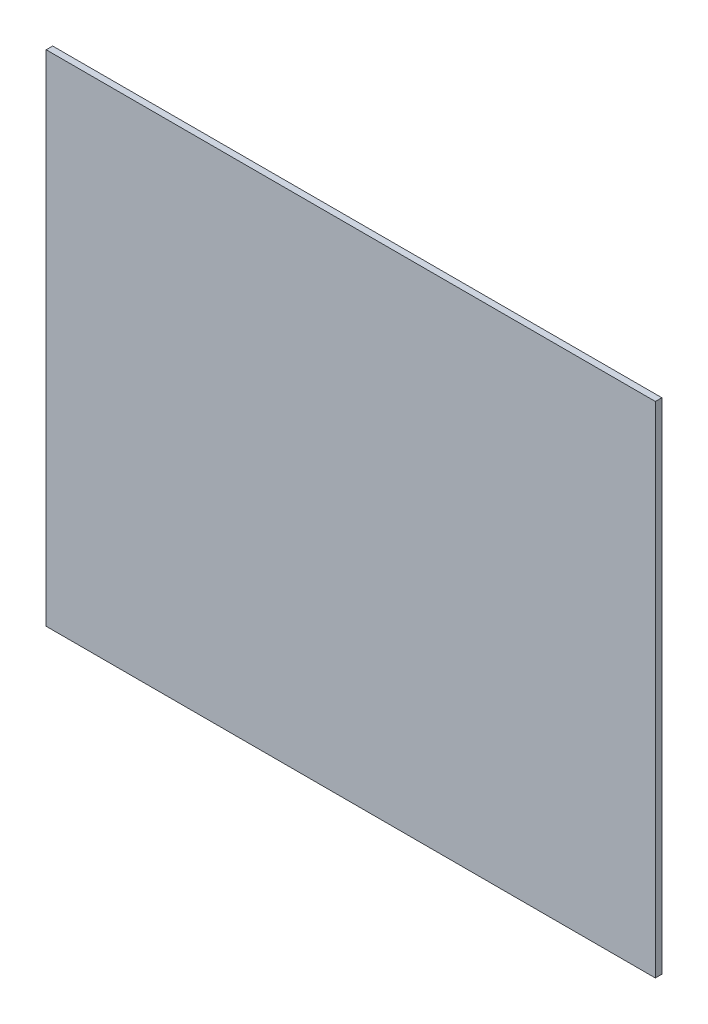
ISO-10303-21;
HEADER;
FILE_DESCRIPTION(('STEP AP214'),'2;1');
FILE_NAME('part.step','',(''),(''),'','','');
FILE_SCHEMA(('AUTOMOTIVE_DESIGN { 1 0 10303 214 1 1 1 1 }'));
ENDSEC;
DATA;
#1=APPLICATION_CONTEXT('core data for automotive mechanical design processes');
#2=APPLICATION_PROTOCOL_DEFINITION('international standard','automotive_design',2000,#1);
#3=PRODUCT_CONTEXT('',#1,'mechanical');
#4=PRODUCT('Part','Part','',(#3));
#5=PRODUCT_RELATED_PRODUCT_CATEGORY('part','',(#4));
#6=PRODUCT_DEFINITION_FORMATION('','',#4);
#7=PRODUCT_DEFINITION_CONTEXT('part definition',#1,'design');
#8=PRODUCT_DEFINITION('design','',#6,#7);
#9=PRODUCT_DEFINITION_SHAPE('','',#8);
#10=(LENGTH_UNIT() NAMED_UNIT(*) SI_UNIT(.MILLI.,.METRE.));
#11=(NAMED_UNIT(*) PLANE_ANGLE_UNIT() SI_UNIT($,.RADIAN.));
#12=(NAMED_UNIT(*) SI_UNIT($,.STERADIAN.) SOLID_ANGLE_UNIT());
#13=UNCERTAINTY_MEASURE_WITH_UNIT(LENGTH_MEASURE(1.E-05),#10,'distance_accuracy_value','');
#14=(GEOMETRIC_REPRESENTATION_CONTEXT(3) GLOBAL_UNCERTAINTY_ASSIGNED_CONTEXT((#13)) GLOBAL_UNIT_ASSIGNED_CONTEXT((#10,
#11,#12)) REPRESENTATION_CONTEXT('',''));
#15=CARTESIAN_POINT('',(0.,0.,0.));
#16=DIRECTION('',(0.,0.,1.));
#17=DIRECTION('',(1.,0.,0.));
#18=AXIS2_PLACEMENT_3D('',#15,#16,#17);
#19=CARTESIAN_POINT('',(0.,0.,0.65));
#20=DIRECTION('',(1.,0.,0.));
#21=DIRECTION('',(0.,0.,-1.));
#22=AXIS2_PLACEMENT_3D('',#19,#20,#21);
#23=PLANE('',#22);
#24=DIRECTION('',(0.,-1.,0.));
#25=VECTOR('',#24,1.);
#26=CARTESIAN_POINT('',(0.,0.,0.));
#27=LINE('',#26,#25);
#28=CARTESIAN_POINT('',(0.,50.,0.));
#29=VERTEX_POINT('',#28);
#30=CARTESIAN_POINT('',(0.,0.,0.));
#31=VERTEX_POINT('',#30);
#32=EDGE_CURVE('E96',#29,#31,#27,.T.);
#33=ORIENTED_EDGE('',*,*,#32,.T.);
#34=DIRECTION('',(0.,0.,-1.));
#35=VECTOR('',#34,1.);
#36=CARTESIAN_POINT('',(0.,0.,0.65));
#37=LINE('',#36,#35);
#38=CARTESIAN_POINT('',(0.,0.,0.65));
#39=VERTEX_POINT('',#38);
#40=EDGE_CURVE('E11',#39,#31,#37,.T.);
#41=ORIENTED_EDGE('',*,*,#40,.F.);
#42=DIRECTION('',(0.,-1.,0.));
#43=VECTOR('',#42,1.);
#44=CARTESIAN_POINT('',(0.,0.,0.65));
#45=LINE('',#44,#43);
#46=CARTESIAN_POINT('',(0.,50.,0.65));
#47=VERTEX_POINT('',#46);
#48=EDGE_CURVE('E84',#47,#39,#45,.T.);
#49=ORIENTED_EDGE('',*,*,#48,.F.);
#50=DIRECTION('',(0.,0.,-1.));
#51=VECTOR('',#50,1.);
#52=CARTESIAN_POINT('',(0.,50.,0.65));
#53=LINE('',#52,#51);
#54=EDGE_CURVE('E92',#47,#29,#53,.T.);
#55=ORIENTED_EDGE('',*,*,#54,.T.);
#56=EDGE_LOOP('',(#33,#41,#49,#55));
#57=FACE_BOUND('',#56,.T.);
#58=ADVANCED_FACE('F33',(#57),#23,.F.);
#59=CARTESIAN_POINT('',(0.,0.,0.65));
#60=DIRECTION('',(0.,1.,0.));
#61=DIRECTION('',(0.,0.,1.));
#62=AXIS2_PLACEMENT_3D('',#59,#60,#61);
#63=PLANE('',#62);
#64=DIRECTION('',(1.,0.,0.));
#65=VECTOR('',#64,1.);
#66=CARTESIAN_POINT('',(0.,0.,0.));
#67=LINE('',#66,#65);
#68=CARTESIAN_POINT('',(61.,0.,0.));
#69=VERTEX_POINT('',#68);
#70=EDGE_CURVE('E88',#31,#69,#67,.T.);
#71=ORIENTED_EDGE('',*,*,#70,.T.);
#72=DIRECTION('',(0.,0.,-1.));
#73=VECTOR('',#72,1.);
#74=CARTESIAN_POINT('',(61.,0.,0.65));
#75=LINE('',#74,#73);
#76=CARTESIAN_POINT('',(61.,0.,0.65));
#77=VERTEX_POINT('',#76);
#78=EDGE_CURVE('E41',#77,#69,#75,.T.);
#79=ORIENTED_EDGE('',*,*,#78,.F.);
#80=DIRECTION('',(1.,0.,0.));
#81=VECTOR('',#80,1.);
#82=CARTESIAN_POINT('',(0.,0.,0.65));
#83=LINE('',#82,#81);
#84=EDGE_CURVE('E79',#39,#77,#83,.T.);
#85=ORIENTED_EDGE('',*,*,#84,.F.);
#86=ORIENTED_EDGE('',*,*,#40,.T.);
#87=EDGE_LOOP('',(#71,#79,#85,#86));
#88=FACE_BOUND('',#87,.T.);
#89=ADVANCED_FACE('F87',(#88),#63,.F.);
#90=CARTESIAN_POINT('',(61.,0.,0.65));
#91=DIRECTION('',(-1.,0.,0.));
#92=DIRECTION('',(0.,0.,1.));
#93=AXIS2_PLACEMENT_3D('',#90,#91,#92);
#94=PLANE('',#93);
#95=DIRECTION('',(0.,1.,0.));
#96=VECTOR('',#95,1.);
#97=CARTESIAN_POINT('',(61.,0.,0.));
#98=LINE('',#97,#96);
#99=CARTESIAN_POINT('',(61.,50.,0.));
#100=VERTEX_POINT('',#99);
#101=EDGE_CURVE('E66',#69,#100,#98,.T.);
#102=ORIENTED_EDGE('',*,*,#101,.T.);
#103=DIRECTION('',(0.,0.,-1.));
#104=VECTOR('',#103,1.);
#105=CARTESIAN_POINT('',(61.,50.,0.65));
#106=LINE('',#105,#104);
#107=CARTESIAN_POINT('',(61.,50.,0.65));
#108=VERTEX_POINT('',#107);
#109=EDGE_CURVE('E89',#108,#100,#106,.T.);
#110=ORIENTED_EDGE('',*,*,#109,.F.);
#111=DIRECTION('',(0.,1.,0.));
#112=VECTOR('',#111,1.);
#113=CARTESIAN_POINT('',(61.,0.,0.65));
#114=LINE('',#113,#112);
#115=EDGE_CURVE('E82',#77,#108,#114,.T.);
#116=ORIENTED_EDGE('',*,*,#115,.F.);
#117=ORIENTED_EDGE('',*,*,#78,.T.);
#118=EDGE_LOOP('',(#102,#110,#116,#117));
#119=FACE_BOUND('',#118,.T.);
#120=ADVANCED_FACE('F90',(#119),#94,.F.);
#121=CARTESIAN_POINT('',(0.,50.,0.65));
#122=DIRECTION('',(0.,-1.,0.));
#123=DIRECTION('',(0.,0.,-1.));
#124=AXIS2_PLACEMENT_3D('',#121,#122,#123);
#125=PLANE('',#124);
#126=DIRECTION('',(-1.,0.,0.));
#127=VECTOR('',#126,1.);
#128=CARTESIAN_POINT('',(0.,50.,0.));
#129=LINE('',#128,#127);
#130=EDGE_CURVE('E72',#100,#29,#129,.T.);
#131=ORIENTED_EDGE('',*,*,#130,.T.);
#132=ORIENTED_EDGE('',*,*,#54,.F.);
#133=DIRECTION('',(-1.,0.,0.));
#134=VECTOR('',#133,1.);
#135=CARTESIAN_POINT('',(0.,50.,0.65));
#136=LINE('',#135,#134);
#137=EDGE_CURVE('E49',#108,#47,#136,.T.);
#138=ORIENTED_EDGE('',*,*,#137,.F.);
#139=ORIENTED_EDGE('',*,*,#109,.T.);
#140=EDGE_LOOP('',(#131,#132,#138,#139));
#141=FACE_BOUND('',#140,.T.);
#142=ADVANCED_FACE('F103',(#141),#125,.F.);
#143=CARTESIAN_POINT('',(0.,0.,0.65));
#144=DIRECTION('',(0.,0.,-1.));
#145=DIRECTION('',(-1.,0.,0.));
#146=AXIS2_PLACEMENT_3D('',#143,#144,#145);
#147=PLANE('',#146);
#148=ORIENTED_EDGE('',*,*,#48,.T.);
#149=ORIENTED_EDGE('',*,*,#84,.T.);
#150=ORIENTED_EDGE('',*,*,#115,.T.);
#151=ORIENTED_EDGE('',*,*,#137,.T.);
#152=EDGE_LOOP('',(#148,#149,#150,#151));
#153=FACE_BOUND('',#152,.T.);
#154=ADVANCED_FACE('F80',(#153),#147,.F.);
#155=CARTESIAN_POINT('',(0.,0.,0.));
#156=DIRECTION('',(0.,0.,-1.));
#157=DIRECTION('',(-1.,0.,0.));
#158=AXIS2_PLACEMENT_3D('',#155,#156,#157);
#159=PLANE('',#158);
#160=ORIENTED_EDGE('',*,*,#32,.F.);
#161=ORIENTED_EDGE('',*,*,#130,.F.);
#162=ORIENTED_EDGE('',*,*,#101,.F.);
#163=ORIENTED_EDGE('',*,*,#70,.F.);
#164=EDGE_LOOP('',(#160,#161,#162,#163));
#165=FACE_BOUND('',#164,.T.);
#166=ADVANCED_FACE('F106',(#165),#159,.T.);
#167=CLOSED_SHELL('',(#58,#89,#120,#142,#154,#166));
#168=MANIFOLD_SOLID_BREP('B2',#167);
#169=ADVANCED_BREP_SHAPE_REPRESENTATION('',(#18,#168),#14);
#170=SHAPE_DEFINITION_REPRESENTATION(#9,#169);
ENDSEC;
END-ISO-10303-21;
